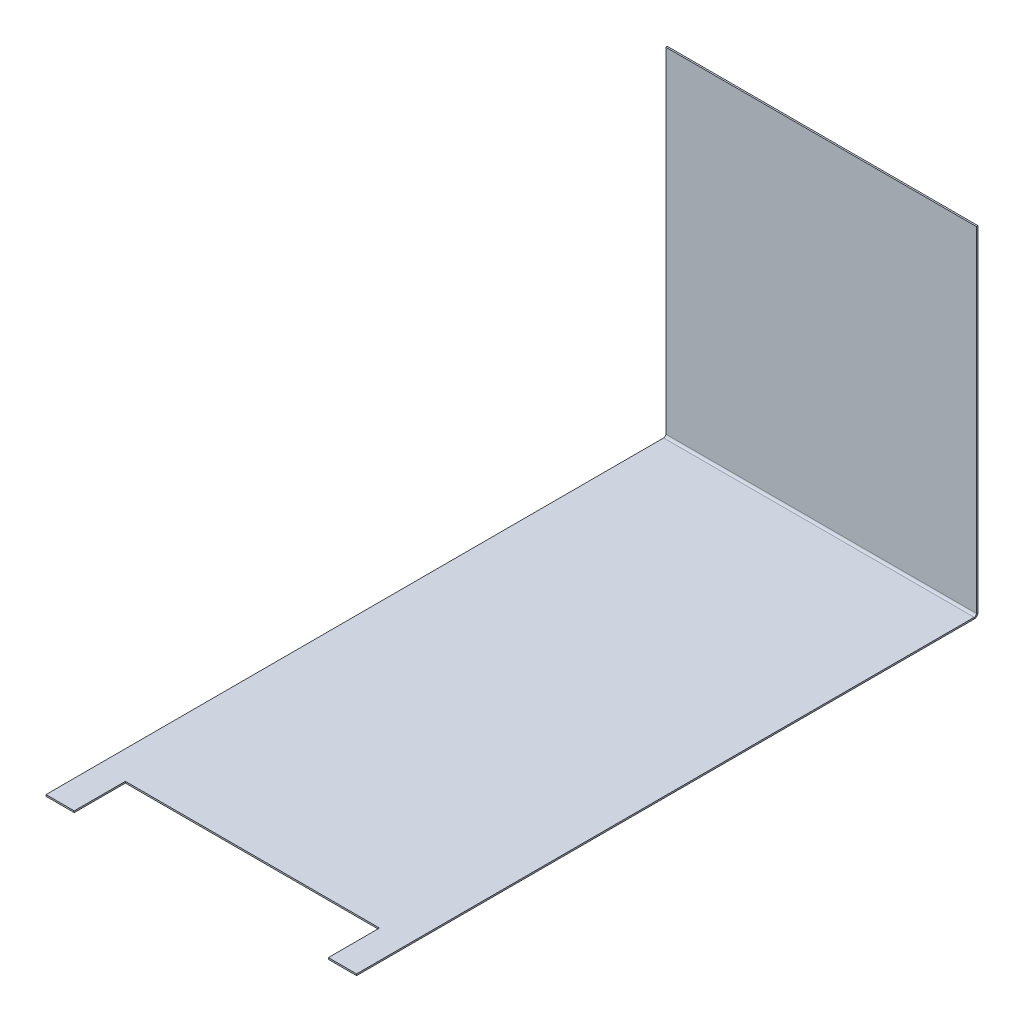
ISO-10303-21;
HEADER;
FILE_DESCRIPTION(('STEP AP214'),'2;1');
FILE_NAME('part.step','',(''),(''),'','','');
FILE_SCHEMA(('AUTOMOTIVE_DESIGN { 1 0 10303 214 1 1 1 1 }'));
ENDSEC;
DATA;
#1=APPLICATION_CONTEXT('core data for automotive mechanical design processes');
#2=APPLICATION_PROTOCOL_DEFINITION('international standard','automotive_design',2000,#1);
#3=PRODUCT_CONTEXT('',#1,'mechanical');
#4=PRODUCT('Part','Part','',(#3));
#5=PRODUCT_RELATED_PRODUCT_CATEGORY('part','',(#4));
#6=PRODUCT_DEFINITION_FORMATION('','',#4);
#7=PRODUCT_DEFINITION_CONTEXT('part definition',#1,'design');
#8=PRODUCT_DEFINITION('design','',#6,#7);
#9=PRODUCT_DEFINITION_SHAPE('','',#8);
#10=(LENGTH_UNIT() NAMED_UNIT(*) SI_UNIT(.MILLI.,.METRE.));
#11=(NAMED_UNIT(*) PLANE_ANGLE_UNIT() SI_UNIT($,.RADIAN.));
#12=(NAMED_UNIT(*) SI_UNIT($,.STERADIAN.) SOLID_ANGLE_UNIT());
#13=UNCERTAINTY_MEASURE_WITH_UNIT(LENGTH_MEASURE(1.E-05),#10,'distance_accuracy_value','');
#14=(GEOMETRIC_REPRESENTATION_CONTEXT(3) GLOBAL_UNCERTAINTY_ASSIGNED_CONTEXT((#13)) GLOBAL_UNIT_ASSIGNED_CONTEXT((#10,
#11,#12)) REPRESENTATION_CONTEXT('',''));
#15=CARTESIAN_POINT('',(0.,0.,0.));
#16=DIRECTION('',(0.,0.,1.));
#17=DIRECTION('',(1.,0.,0.));
#18=AXIS2_PLACEMENT_3D('',#15,#16,#17);
#19=CARTESIAN_POINT('',(69.85,-0.7,127.));
#20=DIRECTION('',(1.,0.,0.));
#21=DIRECTION('',(0.,0.,-1.));
#22=AXIS2_PLACEMENT_3D('',#19,#20,#21);
#23=PLANE('',#22);
#24=DIRECTION('',(0.,0.,-1.));
#25=VECTOR('',#24,1.);
#26=CARTESIAN_POINT('',(69.85,0.,127.));
#27=LINE('',#26,#25);
#28=CARTESIAN_POINT('',(69.85,0.,150.));
#29=VERTEX_POINT('',#28);
#30=CARTESIAN_POINT('',(69.85,0.,-127.8));
#31=VERTEX_POINT('',#30);
#32=EDGE_CURVE('E317',#29,#31,#27,.T.);
#33=ORIENTED_EDGE('',*,*,#32,.F.);
#34=DIRECTION('',(0.,1.,0.));
#35=VECTOR('',#34,1.);
#36=CARTESIAN_POINT('',(69.85,-0.7,150.));
#37=LINE('',#36,#35);
#38=CARTESIAN_POINT('',(69.85,-0.7,150.));
#39=VERTEX_POINT('',#38);
#40=EDGE_CURVE('E236',#39,#29,#37,.T.);
#41=ORIENTED_EDGE('',*,*,#40,.F.);
#42=DIRECTION('',(0.,0.,-1.));
#43=VECTOR('',#42,1.);
#44=CARTESIAN_POINT('',(69.85,-0.7,127.));
#45=LINE('',#44,#43);
#46=CARTESIAN_POINT('',(69.85,-0.700000000000007,-127.8));
#47=VERTEX_POINT('',#46);
#48=EDGE_CURVE('E320',#39,#47,#45,.T.);
#49=ORIENTED_EDGE('',*,*,#48,.T.);
#50=DIRECTION('',(0.,-1.,0.));
#51=VECTOR('',#50,1.);
#52=CARTESIAN_POINT('',(69.85,0.,-127.8));
#53=LINE('',#52,#51);
#54=EDGE_CURVE('E315',#31,#47,#53,.T.);
#55=ORIENTED_EDGE('',*,*,#54,.F.);
#56=EDGE_LOOP('',(#33,#41,#49,#55));
#57=FACE_BOUND('',#56,.T.);
#58=ADVANCED_FACE('F57',(#57),#23,.T.);
#59=CARTESIAN_POINT('',(-69.85,-0.7,127.));
#60=DIRECTION('',(0.,0.,1.));
#61=DIRECTION('',(1.,0.,0.));
#62=AXIS2_PLACEMENT_3D('',#59,#60,#61);
#63=PLANE('',#62);
#64=DIRECTION('',(0.,1.,0.));
#65=VECTOR('',#64,1.);
#66=CARTESIAN_POINT('',(57.15,-0.7,127.));
#67=LINE('',#66,#65);
#68=CARTESIAN_POINT('',(57.15,-0.7,127.));
#69=VERTEX_POINT('',#68);
#70=CARTESIAN_POINT('',(57.15,0.,127.));
#71=VERTEX_POINT('',#70);
#72=EDGE_CURVE('E147',#69,#71,#67,.T.);
#73=ORIENTED_EDGE('',*,*,#72,.T.);
#74=DIRECTION('',(1.,0.,0.));
#75=VECTOR('',#74,1.);
#76=CARTESIAN_POINT('',(-69.85,0.,127.));
#77=LINE('',#76,#75);
#78=CARTESIAN_POINT('',(-57.15,0.,127.));
#79=VERTEX_POINT('',#78);
#80=EDGE_CURVE('E323',#79,#71,#77,.T.);
#81=ORIENTED_EDGE('',*,*,#80,.F.);
#82=DIRECTION('',(0.,1.,0.));
#83=VECTOR('',#82,1.);
#84=CARTESIAN_POINT('',(-57.15,-0.7,127.));
#85=LINE('',#84,#83);
#86=CARTESIAN_POINT('',(-57.15,-0.7,127.));
#87=VERTEX_POINT('',#86);
#88=EDGE_CURVE('E72',#87,#79,#85,.T.);
#89=ORIENTED_EDGE('',*,*,#88,.F.);
#90=DIRECTION('',(1.,0.,0.));
#91=VECTOR('',#90,1.);
#92=CARTESIAN_POINT('',(-69.85,-0.7,127.));
#93=LINE('',#92,#91);
#94=EDGE_CURVE('E13',#87,#69,#93,.T.);
#95=ORIENTED_EDGE('',*,*,#94,.T.);
#96=EDGE_LOOP('',(#73,#81,#89,#95));
#97=FACE_BOUND('',#96,.T.);
#98=ADVANCED_FACE('F165',(#97),#63,.T.);
#99=CARTESIAN_POINT('',(-69.85,-0.7,127.));
#100=DIRECTION('',(-1.,0.,0.));
#101=DIRECTION('',(0.,0.,1.));
#102=AXIS2_PLACEMENT_3D('',#99,#100,#101);
#103=PLANE('',#102);
#104=DIRECTION('',(0.,0.,1.));
#105=VECTOR('',#104,1.);
#106=CARTESIAN_POINT('',(-69.85,0.,127.));
#107=LINE('',#106,#105);
#108=CARTESIAN_POINT('',(-69.85,0.,-127.8));
#109=VERTEX_POINT('',#108);
#110=CARTESIAN_POINT('',(-69.85,0.,150.));
#111=VERTEX_POINT('',#110);
#112=EDGE_CURVE('E327',#109,#111,#107,.T.);
#113=ORIENTED_EDGE('',*,*,#112,.F.);
#114=DIRECTION('',(0.,-1.,0.));
#115=VECTOR('',#114,1.);
#116=CARTESIAN_POINT('',(-69.85,0.,-127.8));
#117=LINE('',#116,#115);
#118=CARTESIAN_POINT('',(-69.85,-0.700000000000007,-127.8));
#119=VERTEX_POINT('',#118);
#120=EDGE_CURVE('E305',#109,#119,#117,.T.);
#121=ORIENTED_EDGE('',*,*,#120,.T.);
#122=DIRECTION('',(0.,0.,1.));
#123=VECTOR('',#122,1.);
#124=CARTESIAN_POINT('',(-69.85,-0.7,127.));
#125=LINE('',#124,#123);
#126=CARTESIAN_POINT('',(-69.85,-0.7,150.));
#127=VERTEX_POINT('',#126);
#128=EDGE_CURVE('E65',#119,#127,#125,.T.);
#129=ORIENTED_EDGE('',*,*,#128,.T.);
#130=DIRECTION('',(0.,1.,0.));
#131=VECTOR('',#130,1.);
#132=CARTESIAN_POINT('',(-69.85,-0.7,150.));
#133=LINE('',#132,#131);
#134=EDGE_CURVE('E264',#127,#111,#133,.T.);
#135=ORIENTED_EDGE('',*,*,#134,.T.);
#136=EDGE_LOOP('',(#113,#121,#129,#135));
#137=FACE_BOUND('',#136,.T.);
#138=ADVANCED_FACE('F167',(#137),#103,.T.);
#139=CARTESIAN_POINT('',(0.,-0.7,0.));
#140=DIRECTION('',(0.,-1.,0.));
#141=DIRECTION('',(0.,0.,-1.));
#142=AXIS2_PLACEMENT_3D('',#139,#140,#141);
#143=PLANE('',#142);
#144=ORIENTED_EDGE('',*,*,#48,.F.);
#145=DIRECTION('',(1.,0.,0.));
#146=VECTOR('',#145,1.);
#147=CARTESIAN_POINT('',(69.85,-0.7,150.));
#148=LINE('',#147,#146);
#149=CARTESIAN_POINT('',(57.15,-0.7,150.));
#150=VERTEX_POINT('',#149);
#151=EDGE_CURVE('E156',#150,#39,#148,.T.);
#152=ORIENTED_EDGE('',*,*,#151,.F.);
#153=DIRECTION('',(0.,0.,1.));
#154=VECTOR('',#153,1.);
#155=CARTESIAN_POINT('',(57.15,-0.7,127.));
#156=LINE('',#155,#154);
#157=EDGE_CURVE('E150',#69,#150,#156,.T.);
#158=ORIENTED_EDGE('',*,*,#157,.F.);
#159=ORIENTED_EDGE('',*,*,#94,.F.);
#160=DIRECTION('',(0.,0.,-1.));
#161=VECTOR('',#160,1.);
#162=CARTESIAN_POINT('',(-57.15,-0.7,127.));
#163=LINE('',#162,#161);
#164=CARTESIAN_POINT('',(-57.15,-0.7,150.));
#165=VERTEX_POINT('',#164);
#166=EDGE_CURVE('E248',#165,#87,#163,.T.);
#167=ORIENTED_EDGE('',*,*,#166,.F.);
#168=DIRECTION('',(1.,0.,0.));
#169=VECTOR('',#168,1.);
#170=CARTESIAN_POINT('',(-69.85,-0.7,150.));
#171=LINE('',#170,#169);
#172=EDGE_CURVE('E245',#127,#165,#171,.T.);
#173=ORIENTED_EDGE('',*,*,#172,.F.);
#174=ORIENTED_EDGE('',*,*,#128,.F.);
#175=DIRECTION('',(-1.,0.,0.));
#176=VECTOR('',#175,1.);
#177=CARTESIAN_POINT('',(-69.85,-0.700000000000007,-127.8));
#178=LINE('',#177,#176);
#179=EDGE_CURVE('E300',#119,#47,#178,.F.);
#180=ORIENTED_EDGE('',*,*,#179,.T.);
#181=EDGE_LOOP('',(#144,#152,#158,#159,#167,#173,#174,#180));
#182=FACE_BOUND('',#181,.T.);
#183=ADVANCED_FACE('F159',(#182),#143,.T.);
#184=CARTESIAN_POINT('',(0.,0.,0.));
#185=DIRECTION('',(0.,-1.,0.));
#186=DIRECTION('',(0.,0.,-1.));
#187=AXIS2_PLACEMENT_3D('',#184,#185,#186);
#188=PLANE('',#187);
#189=ORIENTED_EDGE('',*,*,#32,.T.);
#190=DIRECTION('',(-1.,0.,0.));
#191=VECTOR('',#190,1.);
#192=CARTESIAN_POINT('',(-69.85,0.,-127.8));
#193=LINE('',#192,#191);
#194=EDGE_CURVE('E311',#109,#31,#193,.F.);
#195=ORIENTED_EDGE('',*,*,#194,.F.);
#196=ORIENTED_EDGE('',*,*,#112,.T.);
#197=DIRECTION('',(1.,0.,0.));
#198=VECTOR('',#197,1.);
#199=CARTESIAN_POINT('',(-69.85,0.,150.));
#200=LINE('',#199,#198);
#201=CARTESIAN_POINT('',(-57.15,0.,150.));
#202=VERTEX_POINT('',#201);
#203=EDGE_CURVE('E243',#111,#202,#200,.T.);
#204=ORIENTED_EDGE('',*,*,#203,.T.);
#205=DIRECTION('',(0.,0.,-1.));
#206=VECTOR('',#205,1.);
#207=CARTESIAN_POINT('',(-57.15,0.,127.));
#208=LINE('',#207,#206);
#209=EDGE_CURVE('E249',#202,#79,#208,.T.);
#210=ORIENTED_EDGE('',*,*,#209,.T.);
#211=ORIENTED_EDGE('',*,*,#80,.T.);
#212=DIRECTION('',(0.,0.,1.));
#213=VECTOR('',#212,1.);
#214=CARTESIAN_POINT('',(57.15,0.,127.));
#215=LINE('',#214,#213);
#216=CARTESIAN_POINT('',(57.15,0.,150.));
#217=VERTEX_POINT('',#216);
#218=EDGE_CURVE('E153',#71,#217,#215,.T.);
#219=ORIENTED_EDGE('',*,*,#218,.T.);
#220=DIRECTION('',(1.,0.,0.));
#221=VECTOR('',#220,1.);
#222=CARTESIAN_POINT('',(69.85,0.,150.));
#223=LINE('',#222,#221);
#224=EDGE_CURVE('E163',#217,#29,#223,.T.);
#225=ORIENTED_EDGE('',*,*,#224,.T.);
#226=EDGE_LOOP('',(#189,#195,#196,#204,#210,#211,#219,#225));
#227=FACE_BOUND('',#226,.T.);
#228=ADVANCED_FACE('F176',(#227),#188,.F.);
#229=CARTESIAN_POINT('',(69.85,0.999999999999994,-127.8));
#230=DIRECTION('',(1.,0.,0.));
#231=DIRECTION('',(0.,0.,-1.));
#232=AXIS2_PLACEMENT_3D('',#229,#230,#231);
#233=PLANE('',#232);
#234=DIRECTION('',(0.,0.,1.));
#235=VECTOR('',#234,1.);
#236=CARTESIAN_POINT('',(69.85,1.00000000000001,-129.5));
#237=LINE('',#236,#235);
#238=CARTESIAN_POINT('',(69.85,0.99999999999999,-128.8));
#239=VERTEX_POINT('',#238);
#240=CARTESIAN_POINT('',(69.85,0.999999999999988,-129.5));
#241=VERTEX_POINT('',#240);
#242=EDGE_CURVE('E258',#239,#241,#237,.F.);
#243=ORIENTED_EDGE('',*,*,#242,.F.);
#244=CARTESIAN_POINT('',(69.85,0.999999999999994,-127.8));
#245=DIRECTION('',(-1.,0.,0.));
#246=DIRECTION('',(0.,0.,1.));
#247=AXIS2_PLACEMENT_3D('',#244,#245,#246);
#248=CIRCLE('',#247,1.);
#249=EDGE_CURVE('E308',#31,#239,#248,.F.);
#250=ORIENTED_EDGE('',*,*,#249,.F.);
#251=ORIENTED_EDGE('',*,*,#54,.T.);
#252=CARTESIAN_POINT('',(69.85,0.999999999999994,-127.8));
#253=DIRECTION('',(-1.,0.,0.));
#254=DIRECTION('',(0.,0.,1.));
#255=AXIS2_PLACEMENT_3D('',#252,#253,#254);
#256=CIRCLE('',#255,1.7);
#257=EDGE_CURVE('E80',#47,#241,#256,.F.);
#258=ORIENTED_EDGE('',*,*,#257,.T.);
#259=EDGE_LOOP('',(#243,#250,#251,#258));
#260=FACE_BOUND('',#259,.T.);
#261=ADVANCED_FACE('F179',(#260),#233,.T.);
#262=CARTESIAN_POINT('',(-69.85,0.999999999999994,-127.8));
#263=DIRECTION('',(1.,0.,0.));
#264=DIRECTION('',(0.,0.,-1.));
#265=AXIS2_PLACEMENT_3D('',#262,#263,#264);
#266=PLANE('',#265);
#267=CARTESIAN_POINT('',(-69.85,0.999999999999994,-127.8));
#268=DIRECTION('',(-1.,0.,0.));
#269=DIRECTION('',(0.,0.,1.));
#270=AXIS2_PLACEMENT_3D('',#267,#268,#269);
#271=CIRCLE('',#270,1.);
#272=CARTESIAN_POINT('',(-69.85,0.99999999999999,-128.8));
#273=VERTEX_POINT('',#272);
#274=EDGE_CURVE('E273',#273,#109,#271,.T.);
#275=ORIENTED_EDGE('',*,*,#274,.F.);
#276=DIRECTION('',(0.,0.,1.));
#277=VECTOR('',#276,1.);
#278=CARTESIAN_POINT('',(-69.85,1.,-128.8));
#279=LINE('',#278,#277);
#280=CARTESIAN_POINT('',(-69.85,1.00000000000001,-129.5));
#281=VERTEX_POINT('',#280);
#282=EDGE_CURVE('E293',#273,#281,#279,.F.);
#283=ORIENTED_EDGE('',*,*,#282,.T.);
#284=CARTESIAN_POINT('',(-69.85,0.999999999999994,-127.8));
#285=DIRECTION('',(-1.,0.,0.));
#286=DIRECTION('',(0.,0.,1.));
#287=AXIS2_PLACEMENT_3D('',#284,#285,#286);
#288=CIRCLE('',#287,1.7);
#289=EDGE_CURVE('E303',#281,#119,#288,.T.);
#290=ORIENTED_EDGE('',*,*,#289,.T.);
#291=ORIENTED_EDGE('',*,*,#120,.F.);
#292=EDGE_LOOP('',(#275,#283,#290,#291));
#293=FACE_BOUND('',#292,.T.);
#294=ADVANCED_FACE('F183',(#293),#266,.F.);
#295=CARTESIAN_POINT('',(-69.85,0.999999999999994,-127.8));
#296=DIRECTION('',(-1.,0.,0.));
#297=DIRECTION('',(0.,0.,-1.));
#298=AXIS2_PLACEMENT_3D('',#295,#296,#297);
#299=CYLINDRICAL_SURFACE('',#298,1.7);
#300=ORIENTED_EDGE('',*,*,#179,.F.);
#301=ORIENTED_EDGE('',*,*,#289,.F.);
#302=DIRECTION('',(-1.,0.,0.));
#303=VECTOR('',#302,1.);
#304=CARTESIAN_POINT('',(69.85,1.00000000000001,-129.5));
#305=LINE('',#304,#303);
#306=EDGE_CURVE('E291',#281,#241,#305,.F.);
#307=ORIENTED_EDGE('',*,*,#306,.T.);
#308=ORIENTED_EDGE('',*,*,#257,.F.);
#309=EDGE_LOOP('',(#300,#301,#307,#308));
#310=FACE_BOUND('',#309,.T.);
#311=ADVANCED_FACE('F186',(#310),#299,.T.);
#312=CARTESIAN_POINT('',(-69.85,0.999999999999994,-127.8));
#313=DIRECTION('',(-1.,0.,0.));
#314=DIRECTION('',(0.,0.,-1.));
#315=AXIS2_PLACEMENT_3D('',#312,#313,#314);
#316=CYLINDRICAL_SURFACE('',#315,1.);
#317=ORIENTED_EDGE('',*,*,#194,.T.);
#318=ORIENTED_EDGE('',*,*,#249,.T.);
#319=DIRECTION('',(-1.,0.,0.));
#320=VECTOR('',#319,1.);
#321=CARTESIAN_POINT('',(69.85,1.,-128.8));
#322=LINE('',#321,#320);
#323=EDGE_CURVE('E296',#239,#273,#322,.T.);
#324=ORIENTED_EDGE('',*,*,#323,.T.);
#325=ORIENTED_EDGE('',*,*,#274,.T.);
#326=EDGE_LOOP('',(#317,#318,#324,#325));
#327=FACE_BOUND('',#326,.T.);
#328=ADVANCED_FACE('F191',(#327),#316,.F.);
#329=CARTESIAN_POINT('',(69.85,0.,-129.5));
#330=DIRECTION('',(-1.,0.,0.));
#331=DIRECTION('',(0.,0.,1.));
#332=AXIS2_PLACEMENT_3D('',#329,#330,#331);
#333=PLANE('',#332);
#334=ORIENTED_EDGE('',*,*,#242,.T.);
#335=DIRECTION('',(0.,-1.,0.));
#336=VECTOR('',#335,1.);
#337=CARTESIAN_POINT('',(69.85,-4.43935163901677E-13,-129.5));
#338=LINE('',#337,#336);
#339=CARTESIAN_POINT('',(69.85,151.7,-129.500000000001));
#340=VERTEX_POINT('',#339);
#341=EDGE_CURVE('E281',#340,#241,#338,.T.);
#342=ORIENTED_EDGE('',*,*,#341,.F.);
#343=DIRECTION('',(0.,0.,1.));
#344=VECTOR('',#343,1.);
#345=CARTESIAN_POINT('',(69.85,151.7,-129.500000000001));
#346=LINE('',#345,#344);
#347=CARTESIAN_POINT('',(69.85,151.7,-128.800000000001));
#348=VERTEX_POINT('',#347);
#349=EDGE_CURVE('E274',#340,#348,#346,.T.);
#350=ORIENTED_EDGE('',*,*,#349,.T.);
#351=DIRECTION('',(0.,1.,0.));
#352=VECTOR('',#351,1.);
#353=CARTESIAN_POINT('',(69.85,0.,-128.8));
#354=LINE('',#353,#352);
#355=EDGE_CURVE('E288',#348,#239,#354,.F.);
#356=ORIENTED_EDGE('',*,*,#355,.T.);
#357=EDGE_LOOP('',(#334,#342,#350,#356));
#358=FACE_BOUND('',#357,.T.);
#359=ADVANCED_FACE('F194',(#358),#333,.F.);
#360=CARTESIAN_POINT('',(-69.85,151.7,-129.500000000001));
#361=DIRECTION('',(1.,0.,0.));
#362=DIRECTION('',(0.,0.,-1.));
#363=AXIS2_PLACEMENT_3D('',#360,#361,#362);
#364=PLANE('',#363);
#365=ORIENTED_EDGE('',*,*,#282,.F.);
#366=DIRECTION('',(0.,-1.,0.));
#367=VECTOR('',#366,1.);
#368=CARTESIAN_POINT('',(-69.85,151.7,-128.800000000001));
#369=LINE('',#368,#367);
#370=CARTESIAN_POINT('',(-69.85,151.7,-128.800000000001));
#371=VERTEX_POINT('',#370);
#372=EDGE_CURVE('E286',#273,#371,#369,.F.);
#373=ORIENTED_EDGE('',*,*,#372,.T.);
#374=DIRECTION('',(0.,0.,1.));
#375=VECTOR('',#374,1.);
#376=CARTESIAN_POINT('',(-69.85,151.7,-129.500000000001));
#377=LINE('',#376,#375);
#378=CARTESIAN_POINT('',(-69.85,151.7,-129.500000000001));
#379=VERTEX_POINT('',#378);
#380=EDGE_CURVE('E270',#379,#371,#377,.T.);
#381=ORIENTED_EDGE('',*,*,#380,.F.);
#382=DIRECTION('',(0.,1.,0.));
#383=VECTOR('',#382,1.);
#384=CARTESIAN_POINT('',(-69.85,-4.43935163901677E-13,-129.5));
#385=LINE('',#384,#383);
#386=EDGE_CURVE('E279',#281,#379,#385,.T.);
#387=ORIENTED_EDGE('',*,*,#386,.F.);
#388=EDGE_LOOP('',(#365,#373,#381,#387));
#389=FACE_BOUND('',#388,.T.);
#390=ADVANCED_FACE('F200',(#389),#364,.F.);
#391=CARTESIAN_POINT('',(0.,-4.43935163901677E-13,-129.5));
#392=DIRECTION('',(0.,0.,1.));
#393=DIRECTION('',(0.,-1.,0.));
#394=AXIS2_PLACEMENT_3D('',#391,#392,#393);
#395=PLANE('',#394);
#396=ORIENTED_EDGE('',*,*,#306,.F.);
#397=ORIENTED_EDGE('',*,*,#386,.T.);
#398=DIRECTION('',(1.,0.,0.));
#399=VECTOR('',#398,1.);
#400=CARTESIAN_POINT('',(0.,151.7,-129.500000000001));
#401=LINE('',#400,#399);
#402=EDGE_CURVE('E277',#379,#340,#401,.T.);
#403=ORIENTED_EDGE('',*,*,#402,.T.);
#404=ORIENTED_EDGE('',*,*,#341,.T.);
#405=EDGE_LOOP('',(#396,#397,#403,#404));
#406=FACE_BOUND('',#405,.T.);
#407=ADVANCED_FACE('F204',(#406),#395,.F.);
#408=CARTESIAN_POINT('',(0.,-4.41491126964486E-13,-128.8));
#409=DIRECTION('',(0.,0.,1.));
#410=DIRECTION('',(0.,-1.,0.));
#411=AXIS2_PLACEMENT_3D('',#408,#409,#410);
#412=PLANE('',#411);
#413=ORIENTED_EDGE('',*,*,#372,.F.);
#414=ORIENTED_EDGE('',*,*,#323,.F.);
#415=ORIENTED_EDGE('',*,*,#355,.F.);
#416=DIRECTION('',(-1.,0.,0.));
#417=VECTOR('',#416,1.);
#418=CARTESIAN_POINT('',(69.85,151.7,-128.800000000001));
#419=LINE('',#418,#417);
#420=EDGE_CURVE('E284',#371,#348,#419,.F.);
#421=ORIENTED_EDGE('',*,*,#420,.F.);
#422=EDGE_LOOP('',(#413,#414,#415,#421));
#423=FACE_BOUND('',#422,.T.);
#424=ADVANCED_FACE('F210',(#423),#412,.T.);
#425=CARTESIAN_POINT('',(69.85,151.7,-129.500000000001));
#426=DIRECTION('',(0.,-1.,0.));
#427=DIRECTION('',(0.,0.,-1.));
#428=AXIS2_PLACEMENT_3D('',#425,#426,#427);
#429=PLANE('',#428);
#430=ORIENTED_EDGE('',*,*,#420,.T.);
#431=ORIENTED_EDGE('',*,*,#349,.F.);
#432=ORIENTED_EDGE('',*,*,#402,.F.);
#433=ORIENTED_EDGE('',*,*,#380,.T.);
#434=EDGE_LOOP('',(#430,#431,#432,#433));
#435=FACE_BOUND('',#434,.T.);
#436=ADVANCED_FACE('F206',(#435),#429,.F.);
#437=CARTESIAN_POINT('',(-57.15,-0.7,127.));
#438=DIRECTION('',(1.,0.,0.));
#439=DIRECTION('',(0.,0.,-1.));
#440=AXIS2_PLACEMENT_3D('',#437,#438,#439);
#441=PLANE('',#440);
#442=ORIENTED_EDGE('',*,*,#209,.F.);
#443=DIRECTION('',(0.,1.,0.));
#444=VECTOR('',#443,1.);
#445=CARTESIAN_POINT('',(-57.15,-0.7,150.));
#446=LINE('',#445,#444);
#447=EDGE_CURVE('E254',#165,#202,#446,.T.);
#448=ORIENTED_EDGE('',*,*,#447,.F.);
#449=ORIENTED_EDGE('',*,*,#166,.T.);
#450=ORIENTED_EDGE('',*,*,#88,.T.);
#451=EDGE_LOOP('',(#442,#448,#449,#450));
#452=FACE_BOUND('',#451,.T.);
#453=ADVANCED_FACE('F209',(#452),#441,.T.);
#454=CARTESIAN_POINT('',(-69.85,-0.7,150.));
#455=DIRECTION('',(0.,0.,1.));
#456=DIRECTION('',(1.,0.,0.));
#457=AXIS2_PLACEMENT_3D('',#454,#455,#456);
#458=PLANE('',#457);
#459=ORIENTED_EDGE('',*,*,#203,.F.);
#460=ORIENTED_EDGE('',*,*,#134,.F.);
#461=ORIENTED_EDGE('',*,*,#172,.T.);
#462=ORIENTED_EDGE('',*,*,#447,.T.);
#463=EDGE_LOOP('',(#459,#460,#461,#462));
#464=FACE_BOUND('',#463,.T.);
#465=ADVANCED_FACE('F218',(#464),#458,.T.);
#466=CARTESIAN_POINT('',(69.85,-0.7,150.));
#467=DIRECTION('',(0.,0.,1.));
#468=DIRECTION('',(1.,0.,0.));
#469=AXIS2_PLACEMENT_3D('',#466,#467,#468);
#470=PLANE('',#469);
#471=ORIENTED_EDGE('',*,*,#224,.F.);
#472=DIRECTION('',(0.,1.,0.));
#473=VECTOR('',#472,1.);
#474=CARTESIAN_POINT('',(57.15,-0.7,150.));
#475=LINE('',#474,#473);
#476=EDGE_CURVE('E155',#150,#217,#475,.T.);
#477=ORIENTED_EDGE('',*,*,#476,.F.);
#478=ORIENTED_EDGE('',*,*,#151,.T.);
#479=ORIENTED_EDGE('',*,*,#40,.T.);
#480=EDGE_LOOP('',(#471,#477,#478,#479));
#481=FACE_BOUND('',#480,.T.);
#482=ADVANCED_FACE('F221',(#481),#470,.T.);
#483=CARTESIAN_POINT('',(57.15,-0.7,127.));
#484=DIRECTION('',(-1.,0.,0.));
#485=DIRECTION('',(0.,0.,1.));
#486=AXIS2_PLACEMENT_3D('',#483,#484,#485);
#487=PLANE('',#486);
#488=ORIENTED_EDGE('',*,*,#218,.F.);
#489=ORIENTED_EDGE('',*,*,#72,.F.);
#490=ORIENTED_EDGE('',*,*,#157,.T.);
#491=ORIENTED_EDGE('',*,*,#476,.T.);
#492=EDGE_LOOP('',(#488,#489,#490,#491));
#493=FACE_BOUND('',#492,.T.);
#494=ADVANCED_FACE('F149',(#493),#487,.T.);
#495=CLOSED_SHELL('',(#58,#98,#138,#183,#228,#261,#294,#311,#328,#359,#390,#407,#424,#436,#453,
#465,#482,#494));
#496=MANIFOLD_SOLID_BREP('B2',#495);
#497=ADVANCED_BREP_SHAPE_REPRESENTATION('',(#18,#496),#14);
#498=SHAPE_DEFINITION_REPRESENTATION(#9,#497);
ENDSEC;
END-ISO-10303-21;
